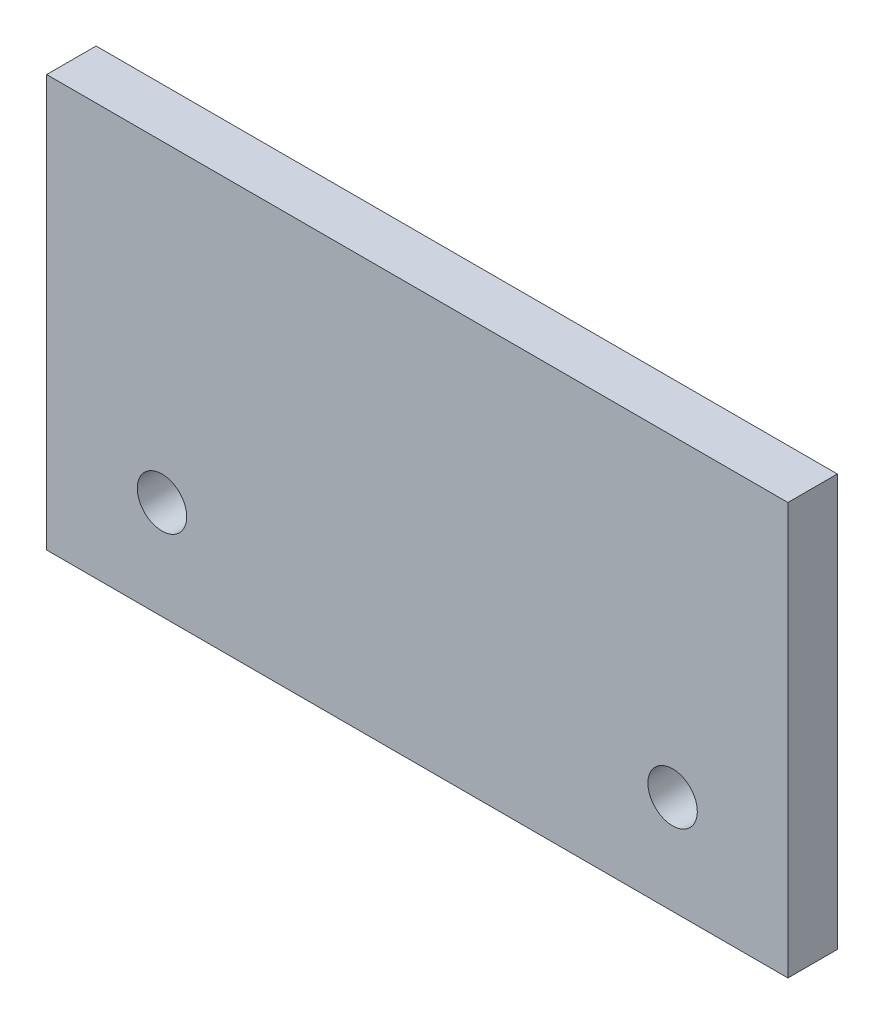
ISO-10303-21;
HEADER;
FILE_DESCRIPTION(('STEP AP214'),'2;1');
FILE_NAME('part.step','',(''),(''),'','','');
FILE_SCHEMA(('AUTOMOTIVE_DESIGN { 1 0 10303 214 1 1 1 1 }'));
ENDSEC;
DATA;
#1=APPLICATION_CONTEXT('core data for automotive mechanical design processes');
#2=APPLICATION_PROTOCOL_DEFINITION('international standard','automotive_design',2000,#1);
#3=PRODUCT_CONTEXT('',#1,'mechanical');
#4=PRODUCT('Part','Part','',(#3));
#5=PRODUCT_RELATED_PRODUCT_CATEGORY('part','',(#4));
#6=PRODUCT_DEFINITION_FORMATION('','',#4);
#7=PRODUCT_DEFINITION_CONTEXT('part definition',#1,'design');
#8=PRODUCT_DEFINITION('design','',#6,#7);
#9=PRODUCT_DEFINITION_SHAPE('','',#8);
#10=(LENGTH_UNIT() NAMED_UNIT(*) SI_UNIT(.MILLI.,.METRE.));
#11=(NAMED_UNIT(*) PLANE_ANGLE_UNIT() SI_UNIT($,.RADIAN.));
#12=(NAMED_UNIT(*) SI_UNIT($,.STERADIAN.) SOLID_ANGLE_UNIT());
#13=UNCERTAINTY_MEASURE_WITH_UNIT(LENGTH_MEASURE(1.E-05),#10,'distance_accuracy_value','');
#14=(GEOMETRIC_REPRESENTATION_CONTEXT(3) GLOBAL_UNCERTAINTY_ASSIGNED_CONTEXT((#13)) GLOBAL_UNIT_ASSIGNED_CONTEXT((#10,
#11,#12)) REPRESENTATION_CONTEXT('',''));
#15=CARTESIAN_POINT('',(0.,0.,0.));
#16=DIRECTION('',(0.,0.,1.));
#17=DIRECTION('',(1.,0.,0.));
#18=AXIS2_PLACEMENT_3D('',#15,#16,#17);
#19=CARTESIAN_POINT('',(0.,0.,3.));
#20=DIRECTION('',(0.,0.,1.));
#21=DIRECTION('',(1.,0.,0.));
#22=AXIS2_PLACEMENT_3D('',#19,#20,#21);
#23=PLANE('',#22);
#24=CARTESIAN_POINT('',(15.5,-6.5,3.));
#25=DIRECTION('',(0.,0.,1.));
#26=DIRECTION('',(1.,0.,0.));
#27=AXIS2_PLACEMENT_3D('',#24,#25,#26);
#28=CIRCLE('',#27,1.5);
#29=CARTESIAN_POINT('',(17.,-6.5,3.));
#30=VERTEX_POINT('',#29);
#31=EDGE_CURVE('E104',#30,#30,#28,.T.);
#32=ORIENTED_EDGE('',*,*,#31,.F.);
#33=EDGE_LOOP('',(#32));
#34=FACE_BOUND('',#33,.T.);
#35=DIRECTION('',(0.,1.,0.));
#36=VECTOR('',#35,1.);
#37=CARTESIAN_POINT('',(22.5,12.5,3.));
#38=LINE('',#37,#36);
#39=CARTESIAN_POINT('',(22.5,-12.5,3.));
#40=VERTEX_POINT('',#39);
#41=CARTESIAN_POINT('',(22.5,12.5,3.));
#42=VERTEX_POINT('',#41);
#43=EDGE_CURVE('E89',#40,#42,#38,.T.);
#44=ORIENTED_EDGE('',*,*,#43,.T.);
#45=DIRECTION('',(-1.,0.,0.));
#46=VECTOR('',#45,1.);
#47=CARTESIAN_POINT('',(-22.5,12.5,3.));
#48=LINE('',#47,#46);
#49=CARTESIAN_POINT('',(-22.5,12.5,3.));
#50=VERTEX_POINT('',#49);
#51=EDGE_CURVE('E84',#42,#50,#48,.T.);
#52=ORIENTED_EDGE('',*,*,#51,.T.);
#53=DIRECTION('',(0.,-1.,0.));
#54=VECTOR('',#53,1.);
#55=CARTESIAN_POINT('',(-22.5,12.5,3.));
#56=LINE('',#55,#54);
#57=CARTESIAN_POINT('',(-22.5,-12.5,3.));
#58=VERTEX_POINT('',#57);
#59=EDGE_CURVE('E87',#50,#58,#56,.T.);
#60=ORIENTED_EDGE('',*,*,#59,.T.);
#61=DIRECTION('',(1.,0.,0.));
#62=VECTOR('',#61,1.);
#63=CARTESIAN_POINT('',(-22.5,-12.5,3.));
#64=LINE('',#63,#62);
#65=EDGE_CURVE('E54',#58,#40,#64,.T.);
#66=ORIENTED_EDGE('',*,*,#65,.T.);
#67=EDGE_LOOP('',(#44,#52,#60,#66));
#68=FACE_BOUND('',#67,.T.);
#69=CARTESIAN_POINT('',(-15.5,-6.5,3.));
#70=DIRECTION('',(0.,0.,1.));
#71=DIRECTION('',(-1.,0.,0.));
#72=AXIS2_PLACEMENT_3D('',#69,#70,#71);
#73=CIRCLE('',#72,1.5);
#74=CARTESIAN_POINT('',(-17.,-6.5,3.));
#75=VERTEX_POINT('',#74);
#76=EDGE_CURVE('E119',#75,#75,#73,.T.);
#77=ORIENTED_EDGE('',*,*,#76,.F.);
#78=EDGE_LOOP('',(#77));
#79=FACE_BOUND('',#78,.T.);
#80=ADVANCED_FACE('F37',(#34,#68,#79),#23,.T.);
#81=CARTESIAN_POINT('',(0.,0.,0.));
#82=DIRECTION('',(0.,0.,1.));
#83=DIRECTION('',(1.,0.,0.));
#84=AXIS2_PLACEMENT_3D('',#81,#82,#83);
#85=PLANE('',#84);
#86=DIRECTION('',(0.,1.,0.));
#87=VECTOR('',#86,1.);
#88=CARTESIAN_POINT('',(22.5,12.5,0.));
#89=LINE('',#88,#87);
#90=CARTESIAN_POINT('',(22.5,-12.5,0.));
#91=VERTEX_POINT('',#90);
#92=CARTESIAN_POINT('',(22.5,12.5,0.));
#93=VERTEX_POINT('',#92);
#94=EDGE_CURVE('E101',#91,#93,#89,.T.);
#95=ORIENTED_EDGE('',*,*,#94,.F.);
#96=DIRECTION('',(1.,0.,0.));
#97=VECTOR('',#96,1.);
#98=CARTESIAN_POINT('',(-22.5,-12.5,0.));
#99=LINE('',#98,#97);
#100=CARTESIAN_POINT('',(-22.5,-12.5,0.));
#101=VERTEX_POINT('',#100);
#102=EDGE_CURVE('E77',#101,#91,#99,.T.);
#103=ORIENTED_EDGE('',*,*,#102,.F.);
#104=DIRECTION('',(0.,-1.,0.));
#105=VECTOR('',#104,1.);
#106=CARTESIAN_POINT('',(-22.5,12.5,0.));
#107=LINE('',#106,#105);
#108=CARTESIAN_POINT('',(-22.5,12.5,0.));
#109=VERTEX_POINT('',#108);
#110=EDGE_CURVE('E71',#109,#101,#107,.T.);
#111=ORIENTED_EDGE('',*,*,#110,.F.);
#112=DIRECTION('',(-1.,0.,0.));
#113=VECTOR('',#112,1.);
#114=CARTESIAN_POINT('',(-22.5,12.5,0.));
#115=LINE('',#114,#113);
#116=EDGE_CURVE('E93',#93,#109,#115,.T.);
#117=ORIENTED_EDGE('',*,*,#116,.F.);
#118=EDGE_LOOP('',(#95,#103,#111,#117));
#119=FACE_BOUND('',#118,.T.);
#120=CARTESIAN_POINT('',(15.5,-6.5,0.));
#121=DIRECTION('',(0.,0.,1.));
#122=DIRECTION('',(1.,0.,0.));
#123=AXIS2_PLACEMENT_3D('',#120,#121,#122);
#124=CIRCLE('',#123,1.5);
#125=CARTESIAN_POINT('',(17.,-6.5,0.));
#126=VERTEX_POINT('',#125);
#127=EDGE_CURVE('E116',#126,#126,#124,.T.);
#128=ORIENTED_EDGE('',*,*,#127,.T.);
#129=EDGE_LOOP('',(#128));
#130=FACE_BOUND('',#129,.T.);
#131=CARTESIAN_POINT('',(-15.5,-6.5,0.));
#132=DIRECTION('',(0.,0.,1.));
#133=DIRECTION('',(-1.,0.,0.));
#134=AXIS2_PLACEMENT_3D('',#131,#132,#133);
#135=CIRCLE('',#134,1.5);
#136=CARTESIAN_POINT('',(-17.,-6.5,0.));
#137=VERTEX_POINT('',#136);
#138=EDGE_CURVE('E122',#137,#137,#135,.T.);
#139=ORIENTED_EDGE('',*,*,#138,.T.);
#140=EDGE_LOOP('',(#139));
#141=FACE_BOUND('',#140,.T.);
#142=ADVANCED_FACE('F112',(#119,#130,#141),#85,.F.);
#143=CARTESIAN_POINT('',(22.5,12.5,3.));
#144=DIRECTION('',(-1.,0.,0.));
#145=DIRECTION('',(0.,0.,1.));
#146=AXIS2_PLACEMENT_3D('',#143,#144,#145);
#147=PLANE('',#146);
#148=ORIENTED_EDGE('',*,*,#94,.T.);
#149=DIRECTION('',(0.,0.,-1.));
#150=VECTOR('',#149,1.);
#151=CARTESIAN_POINT('',(22.5,12.5,3.));
#152=LINE('',#151,#150);
#153=EDGE_CURVE('E11',#42,#93,#152,.T.);
#154=ORIENTED_EDGE('',*,*,#153,.F.);
#155=ORIENTED_EDGE('',*,*,#43,.F.);
#156=DIRECTION('',(0.,0.,-1.));
#157=VECTOR('',#156,1.);
#158=CARTESIAN_POINT('',(22.5,-12.5,3.));
#159=LINE('',#158,#157);
#160=EDGE_CURVE('E97',#40,#91,#159,.T.);
#161=ORIENTED_EDGE('',*,*,#160,.T.);
#162=EDGE_LOOP('',(#148,#154,#155,#161));
#163=FACE_BOUND('',#162,.T.);
#164=ADVANCED_FACE('F39',(#163),#147,.F.);
#165=CARTESIAN_POINT('',(-22.5,12.5,3.));
#166=DIRECTION('',(0.,-1.,0.));
#167=DIRECTION('',(0.,0.,-1.));
#168=AXIS2_PLACEMENT_3D('',#165,#166,#167);
#169=PLANE('',#168);
#170=ORIENTED_EDGE('',*,*,#116,.T.);
#171=DIRECTION('',(0.,0.,-1.));
#172=VECTOR('',#171,1.);
#173=CARTESIAN_POINT('',(-22.5,12.5,3.));
#174=LINE('',#173,#172);
#175=EDGE_CURVE('E46',#50,#109,#174,.T.);
#176=ORIENTED_EDGE('',*,*,#175,.F.);
#177=ORIENTED_EDGE('',*,*,#51,.F.);
#178=ORIENTED_EDGE('',*,*,#153,.T.);
#179=EDGE_LOOP('',(#170,#176,#177,#178));
#180=FACE_BOUND('',#179,.T.);
#181=ADVANCED_FACE('F92',(#180),#169,.F.);
#182=CARTESIAN_POINT('',(-22.5,12.5,3.));
#183=DIRECTION('',(1.,0.,0.));
#184=DIRECTION('',(0.,1.,0.));
#185=AXIS2_PLACEMENT_3D('',#182,#183,#184);
#186=PLANE('',#185);
#187=ORIENTED_EDGE('',*,*,#110,.T.);
#188=DIRECTION('',(0.,0.,-1.));
#189=VECTOR('',#188,1.);
#190=CARTESIAN_POINT('',(-22.5,-12.5,3.));
#191=LINE('',#190,#189);
#192=EDGE_CURVE('E94',#58,#101,#191,.T.);
#193=ORIENTED_EDGE('',*,*,#192,.F.);
#194=ORIENTED_EDGE('',*,*,#59,.F.);
#195=ORIENTED_EDGE('',*,*,#175,.T.);
#196=EDGE_LOOP('',(#187,#193,#194,#195));
#197=FACE_BOUND('',#196,.T.);
#198=ADVANCED_FACE('F95',(#197),#186,.F.);
#199=CARTESIAN_POINT('',(-22.5,-12.5,3.));
#200=DIRECTION('',(0.,1.,0.));
#201=DIRECTION('',(0.,0.,1.));
#202=AXIS2_PLACEMENT_3D('',#199,#200,#201);
#203=PLANE('',#202);
#204=ORIENTED_EDGE('',*,*,#102,.T.);
#205=ORIENTED_EDGE('',*,*,#160,.F.);
#206=ORIENTED_EDGE('',*,*,#65,.F.);
#207=ORIENTED_EDGE('',*,*,#192,.T.);
#208=EDGE_LOOP('',(#204,#205,#206,#207));
#209=FACE_BOUND('',#208,.T.);
#210=ADVANCED_FACE('F109',(#209),#203,.F.);
#211=CARTESIAN_POINT('',(15.5,-6.5,3.));
#212=DIRECTION('',(0.,0.,-1.));
#213=DIRECTION('',(-1.,0.,0.));
#214=AXIS2_PLACEMENT_3D('',#211,#212,#213);
#215=CYLINDRICAL_SURFACE('',#214,1.5);
#216=ORIENTED_EDGE('',*,*,#31,.T.);
#217=EDGE_LOOP('',(#216));
#218=FACE_BOUND('',#217,.T.);
#219=ORIENTED_EDGE('',*,*,#127,.F.);
#220=EDGE_LOOP('',(#219));
#221=FACE_BOUND('',#220,.T.);
#222=ADVANCED_FACE('F139',(#218,#221),#215,.F.);
#223=CARTESIAN_POINT('',(-15.5,-6.5,3.));
#224=DIRECTION('',(0.,0.,-1.));
#225=DIRECTION('',(-1.,0.,0.));
#226=AXIS2_PLACEMENT_3D('',#223,#224,#225);
#227=CYLINDRICAL_SURFACE('',#226,1.5);
#228=ORIENTED_EDGE('',*,*,#76,.T.);
#229=EDGE_LOOP('',(#228));
#230=FACE_BOUND('',#229,.T.);
#231=ORIENTED_EDGE('',*,*,#138,.F.);
#232=EDGE_LOOP('',(#231));
#233=FACE_BOUND('',#232,.T.);
#234=ADVANCED_FACE('F128',(#230,#233),#227,.F.);
#235=CLOSED_SHELL('',(#80,#142,#164,#181,#198,#210,#222,#234));
#236=MANIFOLD_SOLID_BREP('B2',#235);
#237=ADVANCED_BREP_SHAPE_REPRESENTATION('',(#18,#236),#14);
#238=SHAPE_DEFINITION_REPRESENTATION(#9,#237);
ENDSEC;
END-ISO-10303-21;
